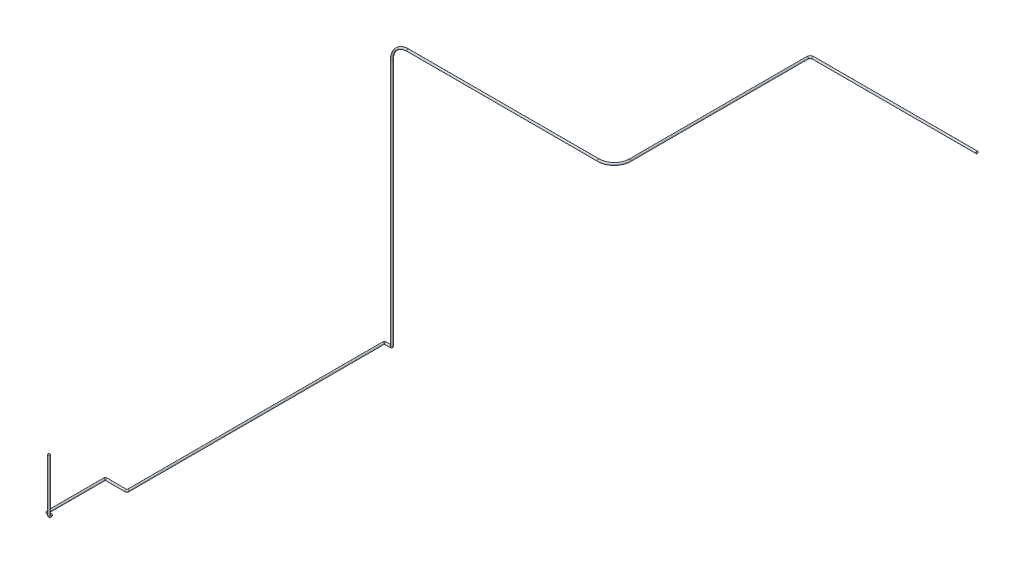
ISO-10303-21;
HEADER;
FILE_DESCRIPTION(('STEP AP214'),'2;1');
FILE_NAME('part.step','',(''),(''),'','','');
FILE_SCHEMA(('AUTOMOTIVE_DESIGN { 1 0 10303 214 1 1 1 1 }'));
ENDSEC;
DATA;
#1=APPLICATION_CONTEXT('core data for automotive mechanical design processes');
#2=APPLICATION_PROTOCOL_DEFINITION('international standard','automotive_design',2000,#1);
#3=PRODUCT_CONTEXT('',#1,'mechanical');
#4=PRODUCT('Part','Part','',(#3));
#5=PRODUCT_RELATED_PRODUCT_CATEGORY('part','',(#4));
#6=PRODUCT_DEFINITION_FORMATION('','',#4);
#7=PRODUCT_DEFINITION_CONTEXT('part definition',#1,'design');
#8=PRODUCT_DEFINITION('design','',#6,#7);
#9=PRODUCT_DEFINITION_SHAPE('','',#8);
#10=(LENGTH_UNIT() NAMED_UNIT(*) SI_UNIT(.MILLI.,.METRE.));
#11=(NAMED_UNIT(*) PLANE_ANGLE_UNIT() SI_UNIT($,.RADIAN.));
#12=(NAMED_UNIT(*) SI_UNIT($,.STERADIAN.) SOLID_ANGLE_UNIT());
#13=UNCERTAINTY_MEASURE_WITH_UNIT(LENGTH_MEASURE(1.E-05),#10,'distance_accuracy_value','');
#14=(GEOMETRIC_REPRESENTATION_CONTEXT(3) GLOBAL_UNCERTAINTY_ASSIGNED_CONTEXT((#13)) GLOBAL_UNIT_ASSIGNED_CONTEXT((#10,
#11,#12)) REPRESENTATION_CONTEXT('',''));
#15=CARTESIAN_POINT('',(0.,0.,0.));
#16=DIRECTION('',(0.,0.,1.));
#17=DIRECTION('',(1.,0.,0.));
#18=AXIS2_PLACEMENT_3D('',#15,#16,#17);
#19=CARTESIAN_POINT('',(0.,-50.,0.));
#20=DIRECTION('',(0.,1.,0.));
#21=DIRECTION('',(0.,0.,1.));
#22=AXIS2_PLACEMENT_3D('',#19,#20,#21);
#23=CYLINDRICAL_SURFACE('',#22,18.);
#24=CARTESIAN_POINT('',(0.,0.,0.));
#25=DIRECTION('',(0.,1.,0.));
#26=DIRECTION('',(0.,0.,1.));
#27=AXIS2_PLACEMENT_3D('',#24,#25,#26);
#28=CIRCLE('',#27,18.);
#29=CARTESIAN_POINT('',(0.,0.,18.));
#30=VERTEX_POINT('',#29);
#31=EDGE_CURVE('E11',#30,#30,#28,.T.);
#32=ORIENTED_EDGE('',*,*,#31,.F.);
#33=EDGE_LOOP('',(#32));
#34=FACE_BOUND('',#33,.T.);
#35=CARTESIAN_POINT('',(0.,-901.,0.));
#36=DIRECTION('',(0.,-1.,0.));
#37=DIRECTION('',(0.,0.,-1.));
#38=AXIS2_PLACEMENT_3D('',#35,#36,#37);
#39=CIRCLE('',#38,18.);
#40=CARTESIAN_POINT('',(0.,-901.,18.));
#41=VERTEX_POINT('',#40);
#42=EDGE_CURVE('E105',#41,#41,#39,.T.);
#43=ORIENTED_EDGE('',*,*,#42,.F.);
#44=EDGE_LOOP('',(#43));
#45=FACE_BOUND('',#44,.T.);
#46=ADVANCED_FACE('F35',(#34,#45),#23,.T.);
#47=CARTESIAN_POINT('',(0.,0.,0.));
#48=DIRECTION('',(0.,1.,0.));
#49=DIRECTION('',(0.,0.,1.));
#50=AXIS2_PLACEMENT_3D('',#47,#48,#49);
#51=PLANE('',#50);
#52=ORIENTED_EDGE('',*,*,#31,.T.);
#53=EDGE_LOOP('',(#52));
#54=FACE_BOUND('',#53,.T.);
#55=ADVANCED_FACE('F112',(#54),#51,.T.);
#56=CARTESIAN_POINT('',(7070.,3610.,-8790.));
#57=DIRECTION('',(1.,0.,0.));
#58=DIRECTION('',(0.,1.,0.));
#59=AXIS2_PLACEMENT_3D('',#56,#57,#58);
#60=PLANE('',#59);
#61=CARTESIAN_POINT('',(7070.,3610.,-8790.));
#62=DIRECTION('',(1.,0.,0.));
#63=DIRECTION('',(0.,1.,0.));
#64=AXIS2_PLACEMENT_3D('',#61,#62,#63);
#65=CIRCLE('',#64,18.);
#66=CARTESIAN_POINT('',(7070.,3628.,-8790.));
#67=VERTEX_POINT('',#66);
#68=EDGE_CURVE('E41',#67,#67,#65,.T.);
#69=ORIENTED_EDGE('',*,*,#68,.T.);
#70=EDGE_LOOP('',(#69));
#71=FACE_BOUND('',#70,.T.);
#72=ADVANCED_FACE('F45',(#71),#60,.T.);
#73=CARTESIAN_POINT('',(0.,-901.,-19.));
#74=DIRECTION('',(1.,0.,0.));
#75=DIRECTION('',(0.,0.,-1.));
#76=AXIS2_PLACEMENT_3D('',#73,#74,#75);
#77=TOROIDAL_SURFACE('',#76,19.,18.);
#78=CARTESIAN_POINT('',(0.,-920.,-19.));
#79=DIRECTION('',(0.,0.,-1.));
#80=DIRECTION('',(0.,1.,0.));
#81=AXIS2_PLACEMENT_3D('',#78,#79,#80);
#82=CIRCLE('',#81,18.);
#83=CARTESIAN_POINT('',(0.,-938.,-19.));
#84=VERTEX_POINT('',#83);
#85=EDGE_CURVE('E102',#84,#84,#82,.T.);
#86=CARTESIAN_POINT('',(0.,-901.,-19.));
#87=DIRECTION('',(1.,0.,0.));
#88=DIRECTION('',(0.,0.,-1.));
#89=AXIS2_PLACEMENT_3D('',#86,#87,#88);
#90=CIRCLE('',#89,37.);
#91=EDGE_CURVE('',#41,#84,#90,.T.);
#92=ORIENTED_EDGE('',*,*,#42,.T.);
#93=ORIENTED_EDGE('',*,*,#85,.F.);
#94=ORIENTED_EDGE('',*,*,#91,.T.);
#95=ORIENTED_EDGE('',*,*,#91,.F.);
#96=EDGE_LOOP('',(#92,#94,#93,#95));
#97=FACE_BOUND('',#96,.T.);
#98=ADVANCED_FACE('F109',(#97),#77,.T.);
#99=CARTESIAN_POINT('',(0.,-920.,-19.));
#100=DIRECTION('',(0.,0.,-1.));
#101=DIRECTION('',(-1.,0.,0.));
#102=AXIS2_PLACEMENT_3D('',#99,#100,#101);
#103=CYLINDRICAL_SURFACE('',#102,18.);
#104=CARTESIAN_POINT('',(0.,-920.,-21.));
#105=DIRECTION('',(0.,0.,-1.));
#106=DIRECTION('',(0.,1.,0.));
#107=AXIS2_PLACEMENT_3D('',#104,#105,#106);
#108=CIRCLE('',#107,18.);
#109=CARTESIAN_POINT('',(18.,-920.,-21.));
#110=VERTEX_POINT('',#109);
#111=EDGE_CURVE('E99',#110,#110,#108,.T.);
#112=ORIENTED_EDGE('',*,*,#111,.F.);
#113=EDGE_LOOP('',(#112));
#114=FACE_BOUND('',#113,.T.);
#115=ORIENTED_EDGE('',*,*,#85,.T.);
#116=EDGE_LOOP('',(#115));
#117=FACE_BOUND('',#116,.T.);
#118=ADVANCED_FACE('F197',(#114,#117),#103,.T.);
#119=CARTESIAN_POINT('',(-19.,-920.,-21.));
#120=DIRECTION('',(0.,1.,0.));
#121=DIRECTION('',(0.,0.,1.));
#122=AXIS2_PLACEMENT_3D('',#119,#120,#121);
#123=TOROIDAL_SURFACE('',#122,19.,18.);
#124=CARTESIAN_POINT('',(-19.,-920.,-40.));
#125=DIRECTION('',(-1.,0.,0.));
#126=DIRECTION('',(0.,1.,0.));
#127=AXIS2_PLACEMENT_3D('',#124,#125,#126);
#128=CIRCLE('',#127,18.);
#129=CARTESIAN_POINT('',(-19.,-920.,-58.));
#130=VERTEX_POINT('',#129);
#131=EDGE_CURVE('E96',#130,#130,#128,.T.);
#132=CARTESIAN_POINT('',(-19.,-920.,-21.));
#133=DIRECTION('',(0.,1.,0.));
#134=DIRECTION('',(0.,0.,1.));
#135=AXIS2_PLACEMENT_3D('',#132,#133,#134);
#136=CIRCLE('',#135,37.);
#137=EDGE_CURVE('',#110,#130,#136,.T.);
#138=ORIENTED_EDGE('',*,*,#111,.T.);
#139=ORIENTED_EDGE('',*,*,#131,.F.);
#140=ORIENTED_EDGE('',*,*,#137,.T.);
#141=ORIENTED_EDGE('',*,*,#137,.F.);
#142=EDGE_LOOP('',(#138,#140,#139,#141));
#143=FACE_BOUND('',#142,.T.);
#144=ADVANCED_FACE('F193',(#143),#123,.T.);
#145=CARTESIAN_POINT('',(-19.,-920.,-40.));
#146=DIRECTION('',(-1.,0.,0.));
#147=DIRECTION('',(0.,0.,1.));
#148=AXIS2_PLACEMENT_3D('',#145,#146,#147);
#149=CYLINDRICAL_SURFACE('',#148,18.);
#150=CARTESIAN_POINT('',(-61.,-920.,-40.));
#151=DIRECTION('',(-1.,0.,0.));
#152=DIRECTION('',(0.,1.,0.));
#153=AXIS2_PLACEMENT_3D('',#150,#151,#152);
#154=CIRCLE('',#153,18.);
#155=CARTESIAN_POINT('',(-61.,-920.,-22.));
#156=VERTEX_POINT('',#155);
#157=EDGE_CURVE('E93',#156,#156,#154,.T.);
#158=ORIENTED_EDGE('',*,*,#157,.F.);
#159=EDGE_LOOP('',(#158));
#160=FACE_BOUND('',#159,.T.);
#161=ORIENTED_EDGE('',*,*,#131,.T.);
#162=EDGE_LOOP('',(#161));
#163=FACE_BOUND('',#162,.T.);
#164=ADVANCED_FACE('F189',(#160,#163),#149,.T.);
#165=CARTESIAN_POINT('',(-61.,-920.,-59.));
#166=DIRECTION('',(0.,-1.,0.));
#167=DIRECTION('',(0.,0.,-1.));
#168=AXIS2_PLACEMENT_3D('',#165,#166,#167);
#169=TOROIDAL_SURFACE('',#168,19.,18.);
#170=CARTESIAN_POINT('',(-80.,-920.,-59.));
#171=DIRECTION('',(0.,0.,-1.));
#172=DIRECTION('',(0.,1.,0.));
#173=AXIS2_PLACEMENT_3D('',#170,#171,#172);
#174=CIRCLE('',#173,18.);
#175=CARTESIAN_POINT('',(-98.,-920.,-59.));
#176=VERTEX_POINT('',#175);
#177=EDGE_CURVE('E90',#176,#176,#174,.T.);
#178=CARTESIAN_POINT('',(-61.,-920.,-59.));
#179=DIRECTION('',(0.,-1.,0.));
#180=DIRECTION('',(0.,0.,-1.));
#181=AXIS2_PLACEMENT_3D('',#178,#179,#180);
#182=CIRCLE('',#181,37.);
#183=EDGE_CURVE('',#156,#176,#182,.T.);
#184=ORIENTED_EDGE('',*,*,#157,.T.);
#185=ORIENTED_EDGE('',*,*,#177,.F.);
#186=ORIENTED_EDGE('',*,*,#183,.T.);
#187=ORIENTED_EDGE('',*,*,#183,.F.);
#188=EDGE_LOOP('',(#184,#186,#185,#187));
#189=FACE_BOUND('',#188,.T.);
#190=ADVANCED_FACE('F185',(#189),#169,.T.);
#191=CARTESIAN_POINT('',(-80.,-920.,-59.));
#192=DIRECTION('',(0.,0.,-1.));
#193=DIRECTION('',(-1.,0.,0.));
#194=AXIS2_PLACEMENT_3D('',#191,#192,#193);
#195=CYLINDRICAL_SURFACE('',#194,18.);
#196=CARTESIAN_POINT('',(-80.,-920.,-1021.));
#197=DIRECTION('',(0.,0.,-1.));
#198=DIRECTION('',(0.,1.,0.));
#199=AXIS2_PLACEMENT_3D('',#196,#197,#198);
#200=CIRCLE('',#199,18.);
#201=CARTESIAN_POINT('',(-98.,-920.,-1021.));
#202=VERTEX_POINT('',#201);
#203=EDGE_CURVE('E87',#202,#202,#200,.T.);
#204=ORIENTED_EDGE('',*,*,#203,.F.);
#205=EDGE_LOOP('',(#204));
#206=FACE_BOUND('',#205,.T.);
#207=ORIENTED_EDGE('',*,*,#177,.T.);
#208=EDGE_LOOP('',(#207));
#209=FACE_BOUND('',#208,.T.);
#210=ADVANCED_FACE('F181',(#206,#209),#195,.T.);
#211=CARTESIAN_POINT('',(-61.,-920.,-1021.));
#212=DIRECTION('',(0.,-1.,0.));
#213=DIRECTION('',(0.,0.,-1.));
#214=AXIS2_PLACEMENT_3D('',#211,#212,#213);
#215=TOROIDAL_SURFACE('',#214,19.,18.);
#216=CARTESIAN_POINT('',(-61.,-920.,-1040.));
#217=DIRECTION('',(1.,0.,0.));
#218=DIRECTION('',(0.,1.,0.));
#219=AXIS2_PLACEMENT_3D('',#216,#217,#218);
#220=CIRCLE('',#219,18.);
#221=CARTESIAN_POINT('',(-61.,-920.,-1058.));
#222=VERTEX_POINT('',#221);
#223=EDGE_CURVE('E84',#222,#222,#220,.T.);
#224=CARTESIAN_POINT('',(-61.,-920.,-1021.));
#225=DIRECTION('',(0.,-1.,0.));
#226=DIRECTION('',(0.,0.,-1.));
#227=AXIS2_PLACEMENT_3D('',#224,#225,#226);
#228=CIRCLE('',#227,37.);
#229=EDGE_CURVE('',#202,#222,#228,.T.);
#230=ORIENTED_EDGE('',*,*,#203,.T.);
#231=ORIENTED_EDGE('',*,*,#223,.F.);
#232=ORIENTED_EDGE('',*,*,#229,.T.);
#233=ORIENTED_EDGE('',*,*,#229,.F.);
#234=EDGE_LOOP('',(#230,#232,#231,#233));
#235=FACE_BOUND('',#234,.T.);
#236=ADVANCED_FACE('F177',(#235),#215,.T.);
#237=CARTESIAN_POINT('',(-61.,-920.,-1040.));
#238=DIRECTION('',(1.,0.,0.));
#239=DIRECTION('',(0.,0.,-1.));
#240=AXIS2_PLACEMENT_3D('',#237,#238,#239);
#241=CYLINDRICAL_SURFACE('',#240,18.);
#242=CARTESIAN_POINT('',(271.,-920.,-1040.));
#243=DIRECTION('',(1.,0.,0.));
#244=DIRECTION('',(0.,1.,0.));
#245=AXIS2_PLACEMENT_3D('',#242,#243,#244);
#246=CIRCLE('',#245,18.);
#247=CARTESIAN_POINT('',(271.,-920.,-1022.));
#248=VERTEX_POINT('',#247);
#249=EDGE_CURVE('E81',#248,#248,#246,.T.);
#250=ORIENTED_EDGE('',*,*,#249,.F.);
#251=EDGE_LOOP('',(#250));
#252=FACE_BOUND('',#251,.T.);
#253=ORIENTED_EDGE('',*,*,#223,.T.);
#254=EDGE_LOOP('',(#253));
#255=FACE_BOUND('',#254,.T.);
#256=ADVANCED_FACE('F173',(#252,#255),#241,.T.);
#257=CARTESIAN_POINT('',(271.,-920.,-1059.));
#258=DIRECTION('',(0.,1.,0.));
#259=DIRECTION('',(0.,0.,1.));
#260=AXIS2_PLACEMENT_3D('',#257,#258,#259);
#261=TOROIDAL_SURFACE('',#260,18.9999999999999,18.);
#262=CARTESIAN_POINT('',(290.,-920.,-1059.));
#263=DIRECTION('',(0.,0.,-1.));
#264=DIRECTION('',(0.,1.,0.));
#265=AXIS2_PLACEMENT_3D('',#262,#263,#264);
#266=CIRCLE('',#265,18.);
#267=CARTESIAN_POINT('',(308.,-920.,-1059.));
#268=VERTEX_POINT('',#267);
#269=EDGE_CURVE('E78',#268,#268,#266,.T.);
#270=CARTESIAN_POINT('',(271.,-920.,-1059.));
#271=DIRECTION('',(0.,1.,0.));
#272=DIRECTION('',(0.,0.,1.));
#273=AXIS2_PLACEMENT_3D('',#270,#271,#272);
#274=CIRCLE('',#273,36.9999999999999);
#275=EDGE_CURVE('',#248,#268,#274,.T.);
#276=ORIENTED_EDGE('',*,*,#249,.T.);
#277=ORIENTED_EDGE('',*,*,#269,.F.);
#278=ORIENTED_EDGE('',*,*,#275,.T.);
#279=ORIENTED_EDGE('',*,*,#275,.F.);
#280=EDGE_LOOP('',(#276,#278,#277,#279));
#281=FACE_BOUND('',#280,.T.);
#282=ADVANCED_FACE('F169',(#281),#261,.T.);
#283=CARTESIAN_POINT('',(290.,-920.,-1059.));
#284=DIRECTION('',(0.,0.,-1.));
#285=DIRECTION('',(-1.,0.,0.));
#286=AXIS2_PLACEMENT_3D('',#283,#284,#285);
#287=CYLINDRICAL_SURFACE('',#286,18.);
#288=CARTESIAN_POINT('',(290.,-920.,-5421.));
#289=DIRECTION('',(0.,0.,-1.));
#290=DIRECTION('',(0.,1.,0.));
#291=AXIS2_PLACEMENT_3D('',#288,#289,#290);
#292=CIRCLE('',#291,18.);
#293=CARTESIAN_POINT('',(272.,-920.,-5421.));
#294=VERTEX_POINT('',#293);
#295=EDGE_CURVE('E75',#294,#294,#292,.T.);
#296=ORIENTED_EDGE('',*,*,#295,.F.);
#297=EDGE_LOOP('',(#296));
#298=FACE_BOUND('',#297,.T.);
#299=ORIENTED_EDGE('',*,*,#269,.T.);
#300=EDGE_LOOP('',(#299));
#301=FACE_BOUND('',#300,.T.);
#302=ADVANCED_FACE('F165',(#298,#301),#287,.T.);
#303=CARTESIAN_POINT('',(309.,-920.,-5421.));
#304=DIRECTION('',(0.,-1.,0.));
#305=DIRECTION('',(0.,0.,-1.));
#306=AXIS2_PLACEMENT_3D('',#303,#304,#305);
#307=TOROIDAL_SURFACE('',#306,19.0000000000001,18.);
#308=CARTESIAN_POINT('',(309.,-920.,-5440.));
#309=DIRECTION('',(1.,0.,0.));
#310=DIRECTION('',(0.,1.,0.));
#311=AXIS2_PLACEMENT_3D('',#308,#309,#310);
#312=CIRCLE('',#311,18.);
#313=CARTESIAN_POINT('',(309.,-920.,-5458.));
#314=VERTEX_POINT('',#313);
#315=EDGE_CURVE('E72',#314,#314,#312,.T.);
#316=CARTESIAN_POINT('',(309.,-920.,-5421.));
#317=DIRECTION('',(0.,-1.,0.));
#318=DIRECTION('',(0.,0.,-1.));
#319=AXIS2_PLACEMENT_3D('',#316,#317,#318);
#320=CIRCLE('',#319,37.0000000000001);
#321=EDGE_CURVE('',#294,#314,#320,.T.);
#322=ORIENTED_EDGE('',*,*,#295,.T.);
#323=ORIENTED_EDGE('',*,*,#315,.F.);
#324=ORIENTED_EDGE('',*,*,#321,.T.);
#325=ORIENTED_EDGE('',*,*,#321,.F.);
#326=EDGE_LOOP('',(#322,#324,#323,#325));
#327=FACE_BOUND('',#326,.T.);
#328=ADVANCED_FACE('F161',(#327),#307,.T.);
#329=CARTESIAN_POINT('',(309.,-920.,-5440.));
#330=DIRECTION('',(1.,0.,0.));
#331=DIRECTION('',(0.,0.,-1.));
#332=AXIS2_PLACEMENT_3D('',#329,#330,#331);
#333=CYLINDRICAL_SURFACE('',#332,18.);
#334=CARTESIAN_POINT('',(401.,-920.,-5440.));
#335=DIRECTION('',(1.,0.,0.));
#336=DIRECTION('',(0.,1.,0.));
#337=AXIS2_PLACEMENT_3D('',#334,#335,#336);
#338=CIRCLE('',#337,18.);
#339=CARTESIAN_POINT('',(401.,-938.,-5440.));
#340=VERTEX_POINT('',#339);
#341=EDGE_CURVE('E69',#340,#340,#338,.T.);
#342=ORIENTED_EDGE('',*,*,#341,.F.);
#343=EDGE_LOOP('',(#342));
#344=FACE_BOUND('',#343,.T.);
#345=ORIENTED_EDGE('',*,*,#315,.T.);
#346=EDGE_LOOP('',(#345));
#347=FACE_BOUND('',#346,.T.);
#348=ADVANCED_FACE('F157',(#344,#347),#333,.T.);
#349=CARTESIAN_POINT('',(401.,-901.,-5440.));
#350=DIRECTION('',(0.,0.,1.));
#351=DIRECTION('',(1.,0.,0.));
#352=AXIS2_PLACEMENT_3D('',#349,#350,#351);
#353=TOROIDAL_SURFACE('',#352,19.,18.);
#354=CARTESIAN_POINT('',(420.,-901.,-5440.));
#355=DIRECTION('',(0.,1.,0.));
#356=DIRECTION('',(-1.,0.,0.));
#357=AXIS2_PLACEMENT_3D('',#354,#355,#356);
#358=CIRCLE('',#357,18.);
#359=CARTESIAN_POINT('',(438.,-901.,-5440.));
#360=VERTEX_POINT('',#359);
#361=EDGE_CURVE('E66',#360,#360,#358,.T.);
#362=CARTESIAN_POINT('',(401.,-901.,-5440.));
#363=DIRECTION('',(0.,0.,1.));
#364=DIRECTION('',(1.,0.,0.));
#365=AXIS2_PLACEMENT_3D('',#362,#363,#364);
#366=CIRCLE('',#365,37.);
#367=EDGE_CURVE('',#340,#360,#366,.T.);
#368=ORIENTED_EDGE('',*,*,#341,.T.);
#369=ORIENTED_EDGE('',*,*,#361,.F.);
#370=ORIENTED_EDGE('',*,*,#367,.T.);
#371=ORIENTED_EDGE('',*,*,#367,.F.);
#372=EDGE_LOOP('',(#368,#370,#369,#371));
#373=FACE_BOUND('',#372,.T.);
#374=ADVANCED_FACE('F153',(#373),#353,.T.);
#375=CARTESIAN_POINT('',(420.,-901.,-5440.));
#376=DIRECTION('',(0.,1.,0.));
#377=DIRECTION('',(0.,0.,1.));
#378=AXIS2_PLACEMENT_3D('',#375,#376,#377);
#379=CYLINDRICAL_SURFACE('',#378,18.);
#380=CARTESIAN_POINT('',(420.,3340.,-5440.));
#381=DIRECTION('',(0.,1.,0.));
#382=DIRECTION('',(-1.,0.,0.));
#383=AXIS2_PLACEMENT_3D('',#380,#381,#382);
#384=CIRCLE('',#383,18.);
#385=CARTESIAN_POINT('',(402.,3340.,-5440.));
#386=VERTEX_POINT('',#385);
#387=EDGE_CURVE('E63',#386,#386,#384,.T.);
#388=ORIENTED_EDGE('',*,*,#387,.F.);
#389=EDGE_LOOP('',(#388));
#390=FACE_BOUND('',#389,.T.);
#391=ORIENTED_EDGE('',*,*,#361,.T.);
#392=EDGE_LOOP('',(#391));
#393=FACE_BOUND('',#392,.T.);
#394=ADVANCED_FACE('F149',(#390,#393),#379,.T.);
#395=CARTESIAN_POINT('',(690.,3340.,-5440.));
#396=DIRECTION('',(0.,0.,-1.));
#397=DIRECTION('',(-1.,0.,0.));
#398=AXIS2_PLACEMENT_3D('',#395,#396,#397);
#399=TOROIDAL_SURFACE('',#398,270.,18.);
#400=CARTESIAN_POINT('',(690.,3610.,-5440.));
#401=DIRECTION('',(1.,0.,0.));
#402=DIRECTION('',(0.,1.,0.));
#403=AXIS2_PLACEMENT_3D('',#400,#401,#402);
#404=CIRCLE('',#403,18.);
#405=CARTESIAN_POINT('',(690.,3628.,-5440.));
#406=VERTEX_POINT('',#405);
#407=EDGE_CURVE('E60',#406,#406,#404,.T.);
#408=CARTESIAN_POINT('',(690.,3340.,-5440.));
#409=DIRECTION('',(0.,0.,-1.));
#410=DIRECTION('',(-1.,0.,0.));
#411=AXIS2_PLACEMENT_3D('',#408,#409,#410);
#412=CIRCLE('',#411,288.);
#413=EDGE_CURVE('',#386,#406,#412,.T.);
#414=ORIENTED_EDGE('',*,*,#387,.T.);
#415=ORIENTED_EDGE('',*,*,#407,.F.);
#416=ORIENTED_EDGE('',*,*,#413,.T.);
#417=ORIENTED_EDGE('',*,*,#413,.F.);
#418=EDGE_LOOP('',(#414,#416,#415,#417));
#419=FACE_BOUND('',#418,.T.);
#420=ADVANCED_FACE('F145',(#419),#399,.T.);
#421=CARTESIAN_POINT('',(690.,3610.,-5440.));
#422=DIRECTION('',(1.,0.,0.));
#423=DIRECTION('',(0.,0.,-1.));
#424=AXIS2_PLACEMENT_3D('',#421,#422,#423);
#425=CYLINDRICAL_SURFACE('',#424,18.);
#426=CARTESIAN_POINT('',(3950.,3610.,-5440.));
#427=DIRECTION('',(1.,0.,0.));
#428=DIRECTION('',(0.,1.,0.));
#429=AXIS2_PLACEMENT_3D('',#426,#427,#428);
#430=CIRCLE('',#429,18.);
#431=CARTESIAN_POINT('',(3950.,3610.,-5422.));
#432=VERTEX_POINT('',#431);
#433=EDGE_CURVE('E57',#432,#432,#430,.T.);
#434=ORIENTED_EDGE('',*,*,#433,.F.);
#435=EDGE_LOOP('',(#434));
#436=FACE_BOUND('',#435,.T.);
#437=ORIENTED_EDGE('',*,*,#407,.T.);
#438=EDGE_LOOP('',(#437));
#439=FACE_BOUND('',#438,.T.);
#440=ADVANCED_FACE('F141',(#436,#439),#425,.T.);
#441=CARTESIAN_POINT('',(3950.,3610.,-5710.));
#442=DIRECTION('',(0.,1.,0.));
#443=DIRECTION('',(0.,0.,1.));
#444=AXIS2_PLACEMENT_3D('',#441,#442,#443);
#445=TOROIDAL_SURFACE('',#444,270.,18.);
#446=CARTESIAN_POINT('',(4220.,3610.,-5710.));
#447=DIRECTION('',(0.,0.,-1.));
#448=DIRECTION('',(0.,1.,0.));
#449=AXIS2_PLACEMENT_3D('',#446,#447,#448);
#450=CIRCLE('',#449,18.);
#451=CARTESIAN_POINT('',(4238.,3610.,-5710.));
#452=VERTEX_POINT('',#451);
#453=EDGE_CURVE('E54',#452,#452,#450,.T.);
#454=CARTESIAN_POINT('',(3950.,3610.,-5710.));
#455=DIRECTION('',(0.,1.,0.));
#456=DIRECTION('',(0.,0.,1.));
#457=AXIS2_PLACEMENT_3D('',#454,#455,#456);
#458=CIRCLE('',#457,288.);
#459=EDGE_CURVE('',#432,#452,#458,.T.);
#460=ORIENTED_EDGE('',*,*,#433,.T.);
#461=ORIENTED_EDGE('',*,*,#453,.F.);
#462=ORIENTED_EDGE('',*,*,#459,.T.);
#463=ORIENTED_EDGE('',*,*,#459,.F.);
#464=EDGE_LOOP('',(#460,#462,#461,#463));
#465=FACE_BOUND('',#464,.T.);
#466=ADVANCED_FACE('F137',(#465),#445,.T.);
#467=CARTESIAN_POINT('',(4220.,3610.,-5710.));
#468=DIRECTION('',(0.,0.,-1.));
#469=DIRECTION('',(-1.,0.,0.));
#470=AXIS2_PLACEMENT_3D('',#467,#468,#469);
#471=CYLINDRICAL_SURFACE('',#470,18.);
#472=CARTESIAN_POINT('',(4220.,3610.,-8740.));
#473=DIRECTION('',(0.,0.,-1.));
#474=DIRECTION('',(0.,1.,0.));
#475=AXIS2_PLACEMENT_3D('',#472,#473,#474);
#476=CIRCLE('',#475,18.);
#477=CARTESIAN_POINT('',(4202.,3610.,-8740.));
#478=VERTEX_POINT('',#477);
#479=EDGE_CURVE('E49',#478,#478,#476,.T.);
#480=ORIENTED_EDGE('',*,*,#479,.F.);
#481=EDGE_LOOP('',(#480));
#482=FACE_BOUND('',#481,.T.);
#483=ORIENTED_EDGE('',*,*,#453,.T.);
#484=EDGE_LOOP('',(#483));
#485=FACE_BOUND('',#484,.T.);
#486=ADVANCED_FACE('F130',(#482,#485),#471,.T.);
#487=CARTESIAN_POINT('',(4270.,3610.,-8740.));
#488=DIRECTION('',(0.,-1.,0.));
#489=DIRECTION('',(0.,0.,-1.));
#490=AXIS2_PLACEMENT_3D('',#487,#488,#489);
#491=TOROIDAL_SURFACE('',#490,50.0000000000007,18.);
#492=CARTESIAN_POINT('',(4270.,3610.,-8790.));
#493=DIRECTION('',(1.,0.,0.));
#494=DIRECTION('',(0.,1.,0.));
#495=AXIS2_PLACEMENT_3D('',#492,#493,#494);
#496=CIRCLE('',#495,18.);
#497=CARTESIAN_POINT('',(4270.,3610.,-8808.));
#498=VERTEX_POINT('',#497);
#499=EDGE_CURVE('E47',#498,#498,#496,.T.);
#500=CARTESIAN_POINT('',(4270.,3610.,-8740.));
#501=DIRECTION('',(0.,-1.,0.));
#502=DIRECTION('',(0.,0.,-1.));
#503=AXIS2_PLACEMENT_3D('',#500,#501,#502);
#504=CIRCLE('',#503,68.0000000000007);
#505=EDGE_CURVE('',#478,#498,#504,.T.);
#506=ORIENTED_EDGE('',*,*,#479,.T.);
#507=ORIENTED_EDGE('',*,*,#499,.F.);
#508=ORIENTED_EDGE('',*,*,#505,.T.);
#509=ORIENTED_EDGE('',*,*,#505,.F.);
#510=EDGE_LOOP('',(#506,#508,#507,#509));
#511=FACE_BOUND('',#510,.T.);
#512=ADVANCED_FACE('F125',(#511),#491,.T.);
#513=CARTESIAN_POINT('',(4270.,3610.,-8790.));
#514=DIRECTION('',(1.,0.,0.));
#515=DIRECTION('',(0.,0.,-1.));
#516=AXIS2_PLACEMENT_3D('',#513,#514,#515);
#517=CYLINDRICAL_SURFACE('',#516,18.);
#518=ORIENTED_EDGE('',*,*,#68,.F.);
#519=EDGE_LOOP('',(#518));
#520=FACE_BOUND('',#519,.T.);
#521=ORIENTED_EDGE('',*,*,#499,.T.);
#522=EDGE_LOOP('',(#521));
#523=FACE_BOUND('',#522,.T.);
#524=ADVANCED_FACE('F118',(#520,#523),#517,.T.);
#525=CLOSED_SHELL('',(#46,#55,#72,#98,#118,#144,#164,#190,#210,#236,#256,#282,#302,#328,#348,
#374,#394,#420,#440,#466,#486,#512,#524));
#526=MANIFOLD_SOLID_BREP('B2',#525);
#527=ADVANCED_BREP_SHAPE_REPRESENTATION('',(#18,#526),#14);
#528=SHAPE_DEFINITION_REPRESENTATION(#9,#527);
ENDSEC;
END-ISO-10303-21;
